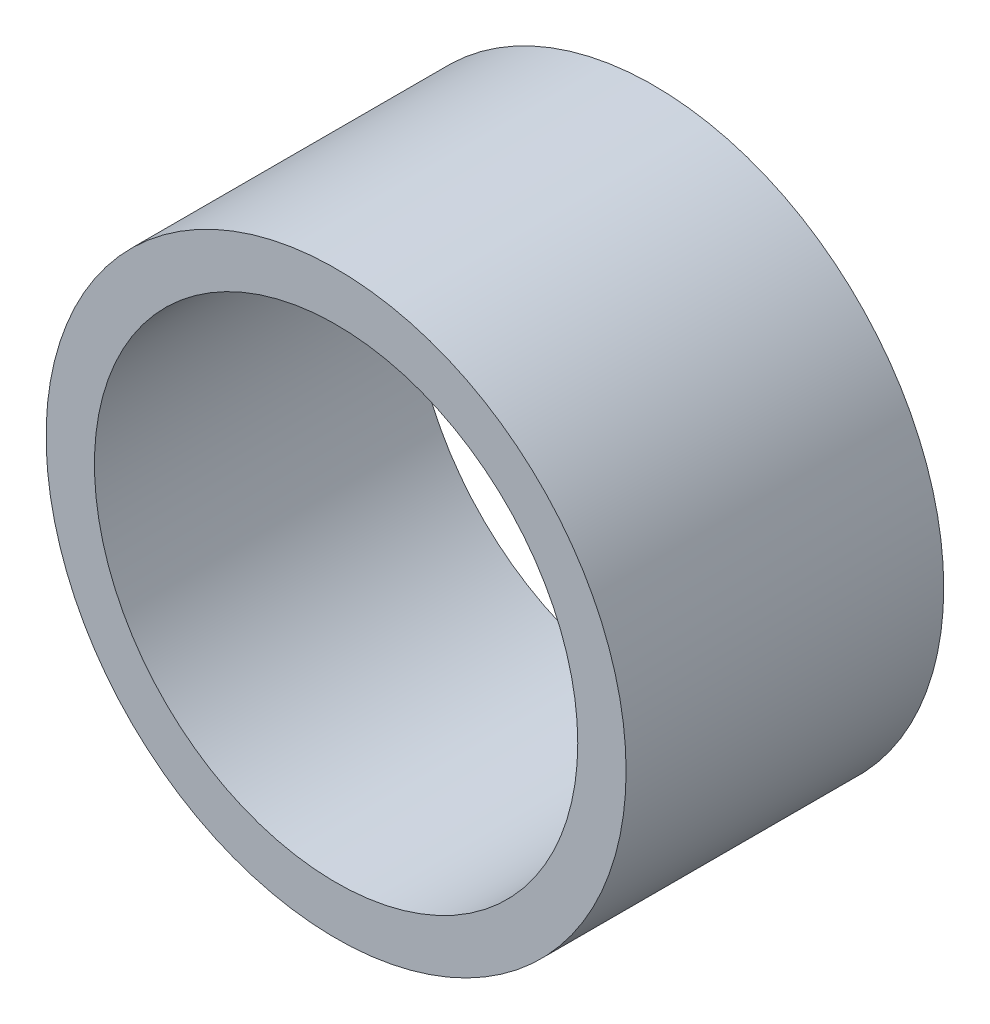
ISO-10303-21;
HEADER;
FILE_DESCRIPTION(('STEP AP214'),'2;1');
FILE_NAME('part.step','',(''),(''),'','','');
FILE_SCHEMA(('AUTOMOTIVE_DESIGN { 1 0 10303 214 1 1 1 1 }'));
ENDSEC;
DATA;
#1=APPLICATION_CONTEXT('core data for automotive mechanical design processes');
#2=APPLICATION_PROTOCOL_DEFINITION('international standard','automotive_design',2000,#1);
#3=PRODUCT_CONTEXT('',#1,'mechanical');
#4=PRODUCT('Part','Part','',(#3));
#5=PRODUCT_RELATED_PRODUCT_CATEGORY('part','',(#4));
#6=PRODUCT_DEFINITION_FORMATION('','',#4);
#7=PRODUCT_DEFINITION_CONTEXT('part definition',#1,'design');
#8=PRODUCT_DEFINITION('design','',#6,#7);
#9=PRODUCT_DEFINITION_SHAPE('','',#8);
#10=(LENGTH_UNIT() NAMED_UNIT(*) SI_UNIT(.MILLI.,.METRE.));
#11=(NAMED_UNIT(*) PLANE_ANGLE_UNIT() SI_UNIT($,.RADIAN.));
#12=(NAMED_UNIT(*) SI_UNIT($,.STERADIAN.) SOLID_ANGLE_UNIT());
#13=UNCERTAINTY_MEASURE_WITH_UNIT(LENGTH_MEASURE(1.E-05),#10,'distance_accuracy_value','');
#14=(GEOMETRIC_REPRESENTATION_CONTEXT(3) GLOBAL_UNCERTAINTY_ASSIGNED_CONTEXT((#13)) GLOBAL_UNIT_ASSIGNED_CONTEXT((#10,
#11,#12)) REPRESENTATION_CONTEXT('',''));
#15=CARTESIAN_POINT('',(0.,0.,0.));
#16=DIRECTION('',(0.,0.,1.));
#17=DIRECTION('',(1.,0.,0.));
#18=AXIS2_PLACEMENT_3D('',#15,#16,#17);
#19=CARTESIAN_POINT('',(0.,0.,23.));
#20=DIRECTION('',(0.,0.,1.));
#21=DIRECTION('',(1.,0.,0.));
#22=AXIS2_PLACEMENT_3D('',#19,#20,#21);
#23=PLANE('',#22);
#24=CARTESIAN_POINT('',(0.,0.,23.));
#25=DIRECTION('',(0.,0.,1.));
#26=DIRECTION('',(1.,0.,0.));
#27=AXIS2_PLACEMENT_3D('',#24,#25,#26);
#28=CIRCLE('',#27,21.);
#29=CARTESIAN_POINT('',(21.,0.,23.));
#30=VERTEX_POINT('',#29);
#31=EDGE_CURVE('E10',#30,#30,#28,.T.);
#32=ORIENTED_EDGE('',*,*,#31,.T.);
#33=EDGE_LOOP('',(#32));
#34=FACE_BOUND('',#33,.T.);
#35=CARTESIAN_POINT('',(0.,0.,23.));
#36=DIRECTION('',(0.,0.,1.));
#37=DIRECTION('',(1.,0.,0.));
#38=AXIS2_PLACEMENT_3D('',#35,#36,#37);
#39=CIRCLE('',#38,17.5);
#40=CARTESIAN_POINT('',(17.5,0.,23.));
#41=VERTEX_POINT('',#40);
#42=EDGE_CURVE('E41',#41,#41,#39,.T.);
#43=ORIENTED_EDGE('',*,*,#42,.F.);
#44=EDGE_LOOP('',(#43));
#45=FACE_BOUND('',#44,.T.);
#46=ADVANCED_FACE('F30',(#34,#45),#23,.T.);
#47=CARTESIAN_POINT('',(0.,0.,0.));
#48=DIRECTION('',(0.,0.,1.));
#49=DIRECTION('',(1.,0.,0.));
#50=AXIS2_PLACEMENT_3D('',#47,#48,#49);
#51=PLANE('',#50);
#52=CARTESIAN_POINT('',(0.,0.,0.));
#53=DIRECTION('',(0.,0.,1.));
#54=DIRECTION('',(1.,0.,0.));
#55=AXIS2_PLACEMENT_3D('',#52,#53,#54);
#56=CIRCLE('',#55,21.);
#57=CARTESIAN_POINT('',(21.,0.,0.));
#58=VERTEX_POINT('',#57);
#59=EDGE_CURVE('E34',#58,#58,#56,.T.);
#60=ORIENTED_EDGE('',*,*,#59,.F.);
#61=EDGE_LOOP('',(#60));
#62=FACE_BOUND('',#61,.T.);
#63=CARTESIAN_POINT('',(0.,0.,0.));
#64=DIRECTION('',(0.,0.,1.));
#65=DIRECTION('',(1.,0.,0.));
#66=AXIS2_PLACEMENT_3D('',#63,#64,#65);
#67=CIRCLE('',#66,17.5);
#68=CARTESIAN_POINT('',(17.5,0.,0.));
#69=VERTEX_POINT('',#68);
#70=EDGE_CURVE('E43',#69,#69,#67,.T.);
#71=ORIENTED_EDGE('',*,*,#70,.T.);
#72=EDGE_LOOP('',(#71));
#73=FACE_BOUND('',#72,.T.);
#74=ADVANCED_FACE('F53',(#62,#73),#51,.F.);
#75=CARTESIAN_POINT('',(0.,0.,23.));
#76=DIRECTION('',(0.,0.,-1.));
#77=DIRECTION('',(-1.,0.,0.));
#78=AXIS2_PLACEMENT_3D('',#75,#76,#77);
#79=CYLINDRICAL_SURFACE('',#78,21.);
#80=ORIENTED_EDGE('',*,*,#31,.F.);
#81=EDGE_LOOP('',(#80));
#82=FACE_BOUND('',#81,.T.);
#83=ORIENTED_EDGE('',*,*,#59,.T.);
#84=EDGE_LOOP('',(#83));
#85=FACE_BOUND('',#84,.T.);
#86=ADVANCED_FACE('F32',(#82,#85),#79,.T.);
#87=CARTESIAN_POINT('',(0.,0.,23.));
#88=DIRECTION('',(0.,0.,-1.));
#89=DIRECTION('',(-1.,0.,0.));
#90=AXIS2_PLACEMENT_3D('',#87,#88,#89);
#91=CYLINDRICAL_SURFACE('',#90,17.5);
#92=ORIENTED_EDGE('',*,*,#42,.T.);
#93=EDGE_LOOP('',(#92));
#94=FACE_BOUND('',#93,.T.);
#95=ORIENTED_EDGE('',*,*,#70,.F.);
#96=EDGE_LOOP('',(#95));
#97=FACE_BOUND('',#96,.T.);
#98=ADVANCED_FACE('F49',(#94,#97),#91,.F.);
#99=CLOSED_SHELL('',(#46,#74,#86,#98));
#100=MANIFOLD_SOLID_BREP('B2',#99);
#101=ADVANCED_BREP_SHAPE_REPRESENTATION('',(#18,#100),#14);
#102=SHAPE_DEFINITION_REPRESENTATION(#9,#101);
ENDSEC;
END-ISO-10303-21;
